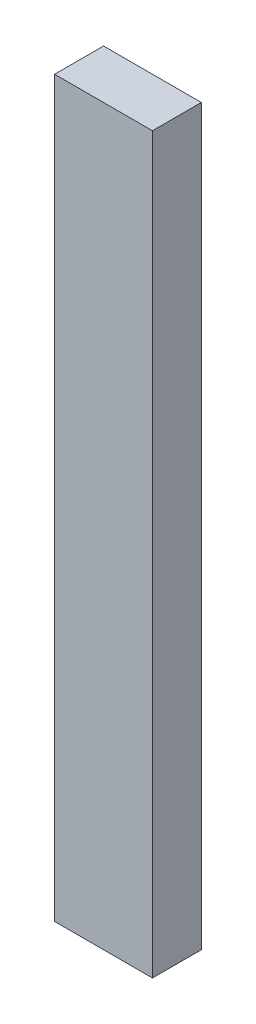
ISO-10303-21;
HEADER;
FILE_DESCRIPTION(('STEP AP214'),'2;1');
FILE_NAME('part.step','',(''),(''),'','','');
FILE_SCHEMA(('AUTOMOTIVE_DESIGN { 1 0 10303 214 1 1 1 1 }'));
ENDSEC;
DATA;
#1=APPLICATION_CONTEXT('core data for automotive mechanical design processes');
#2=APPLICATION_PROTOCOL_DEFINITION('international standard','automotive_design',2000,#1);
#3=PRODUCT_CONTEXT('',#1,'mechanical');
#4=PRODUCT('Part','Part','',(#3));
#5=PRODUCT_RELATED_PRODUCT_CATEGORY('part','',(#4));
#6=PRODUCT_DEFINITION_FORMATION('','',#4);
#7=PRODUCT_DEFINITION_CONTEXT('part definition',#1,'design');
#8=PRODUCT_DEFINITION('design','',#6,#7);
#9=PRODUCT_DEFINITION_SHAPE('','',#8);
#10=(LENGTH_UNIT() NAMED_UNIT(*) SI_UNIT(.MILLI.,.METRE.));
#11=(NAMED_UNIT(*) PLANE_ANGLE_UNIT() SI_UNIT($,.RADIAN.));
#12=(NAMED_UNIT(*) SI_UNIT($,.STERADIAN.) SOLID_ANGLE_UNIT());
#13=UNCERTAINTY_MEASURE_WITH_UNIT(LENGTH_MEASURE(1.E-05),#10,'distance_accuracy_value','');
#14=(GEOMETRIC_REPRESENTATION_CONTEXT(3) GLOBAL_UNCERTAINTY_ASSIGNED_CONTEXT((#13)) GLOBAL_UNIT_ASSIGNED_CONTEXT((#10,
#11,#12)) REPRESENTATION_CONTEXT('',''));
#15=CARTESIAN_POINT('',(0.,0.,0.));
#16=DIRECTION('',(0.,0.,1.));
#17=DIRECTION('',(1.,0.,0.));
#18=AXIS2_PLACEMENT_3D('',#15,#16,#17);
#19=CARTESIAN_POINT('',(10.,150.,-5.));
#20=DIRECTION('',(-1.,0.,0.));
#21=DIRECTION('',(0.,0.,1.));
#22=AXIS2_PLACEMENT_3D('',#19,#20,#21);
#23=PLANE('',#22);
#24=DIRECTION('',(0.,0.,-1.));
#25=VECTOR('',#24,1.);
#26=CARTESIAN_POINT('',(10.,0.,-5.));
#27=LINE('',#26,#25);
#28=CARTESIAN_POINT('',(10.,0.,5.));
#29=VERTEX_POINT('',#28);
#30=CARTESIAN_POINT('',(10.,0.,-5.));
#31=VERTEX_POINT('',#30);
#32=EDGE_CURVE('E95',#29,#31,#27,.T.);
#33=ORIENTED_EDGE('',*,*,#32,.T.);
#34=DIRECTION('',(0.,-1.,0.));
#35=VECTOR('',#34,1.);
#36=CARTESIAN_POINT('',(10.,150.,-5.));
#37=LINE('',#36,#35);
#38=CARTESIAN_POINT('',(10.,150.,-5.));
#39=VERTEX_POINT('',#38);
#40=EDGE_CURVE('E11',#39,#31,#37,.T.);
#41=ORIENTED_EDGE('',*,*,#40,.F.);
#42=DIRECTION('',(0.,0.,-1.));
#43=VECTOR('',#42,1.);
#44=CARTESIAN_POINT('',(10.,150.,-5.));
#45=LINE('',#44,#43);
#46=CARTESIAN_POINT('',(10.,150.,5.));
#47=VERTEX_POINT('',#46);
#48=EDGE_CURVE('E83',#47,#39,#45,.T.);
#49=ORIENTED_EDGE('',*,*,#48,.F.);
#50=DIRECTION('',(0.,-1.,0.));
#51=VECTOR('',#50,1.);
#52=CARTESIAN_POINT('',(10.,150.,5.));
#53=LINE('',#52,#51);
#54=EDGE_CURVE('E91',#47,#29,#53,.T.);
#55=ORIENTED_EDGE('',*,*,#54,.T.);
#56=EDGE_LOOP('',(#33,#41,#49,#55));
#57=FACE_BOUND('',#56,.T.);
#58=ADVANCED_FACE('F32',(#57),#23,.F.);
#59=CARTESIAN_POINT('',(-10.,150.,-5.));
#60=DIRECTION('',(0.,0.,1.));
#61=DIRECTION('',(1.,0.,0.));
#62=AXIS2_PLACEMENT_3D('',#59,#60,#61);
#63=PLANE('',#62);
#64=DIRECTION('',(-1.,0.,0.));
#65=VECTOR('',#64,1.);
#66=CARTESIAN_POINT('',(-10.,0.,-5.));
#67=LINE('',#66,#65);
#68=CARTESIAN_POINT('',(-10.,0.,-5.));
#69=VERTEX_POINT('',#68);
#70=EDGE_CURVE('E87',#31,#69,#67,.T.);
#71=ORIENTED_EDGE('',*,*,#70,.T.);
#72=DIRECTION('',(0.,-1.,0.));
#73=VECTOR('',#72,1.);
#74=CARTESIAN_POINT('',(-10.,150.,-5.));
#75=LINE('',#74,#73);
#76=CARTESIAN_POINT('',(-10.,150.,-5.));
#77=VERTEX_POINT('',#76);
#78=EDGE_CURVE('E40',#77,#69,#75,.T.);
#79=ORIENTED_EDGE('',*,*,#78,.F.);
#80=DIRECTION('',(-1.,0.,0.));
#81=VECTOR('',#80,1.);
#82=CARTESIAN_POINT('',(-10.,150.,-5.));
#83=LINE('',#82,#81);
#84=EDGE_CURVE('E78',#39,#77,#83,.T.);
#85=ORIENTED_EDGE('',*,*,#84,.F.);
#86=ORIENTED_EDGE('',*,*,#40,.T.);
#87=EDGE_LOOP('',(#71,#79,#85,#86));
#88=FACE_BOUND('',#87,.T.);
#89=ADVANCED_FACE('F86',(#88),#63,.F.);
#90=CARTESIAN_POINT('',(-10.,150.,-5.));
#91=DIRECTION('',(1.,0.,0.));
#92=DIRECTION('',(0.,0.,-1.));
#93=AXIS2_PLACEMENT_3D('',#90,#91,#92);
#94=PLANE('',#93);
#95=DIRECTION('',(0.,0.,1.));
#96=VECTOR('',#95,1.);
#97=CARTESIAN_POINT('',(-10.,0.,-5.));
#98=LINE('',#97,#96);
#99=CARTESIAN_POINT('',(-10.,0.,5.));
#100=VERTEX_POINT('',#99);
#101=EDGE_CURVE('E65',#69,#100,#98,.T.);
#102=ORIENTED_EDGE('',*,*,#101,.T.);
#103=DIRECTION('',(0.,-1.,0.));
#104=VECTOR('',#103,1.);
#105=CARTESIAN_POINT('',(-10.,150.,5.));
#106=LINE('',#105,#104);
#107=CARTESIAN_POINT('',(-10.,150.,5.));
#108=VERTEX_POINT('',#107);
#109=EDGE_CURVE('E88',#108,#100,#106,.T.);
#110=ORIENTED_EDGE('',*,*,#109,.F.);
#111=DIRECTION('',(0.,0.,1.));
#112=VECTOR('',#111,1.);
#113=CARTESIAN_POINT('',(-10.,150.,-5.));
#114=LINE('',#113,#112);
#115=EDGE_CURVE('E81',#77,#108,#114,.T.);
#116=ORIENTED_EDGE('',*,*,#115,.F.);
#117=ORIENTED_EDGE('',*,*,#78,.T.);
#118=EDGE_LOOP('',(#102,#110,#116,#117));
#119=FACE_BOUND('',#118,.T.);
#120=ADVANCED_FACE('F89',(#119),#94,.F.);
#121=CARTESIAN_POINT('',(-10.,150.,5.));
#122=DIRECTION('',(0.,0.,-1.));
#123=DIRECTION('',(-1.,0.,0.));
#124=AXIS2_PLACEMENT_3D('',#121,#122,#123);
#125=PLANE('',#124);
#126=DIRECTION('',(1.,0.,0.));
#127=VECTOR('',#126,1.);
#128=CARTESIAN_POINT('',(-10.,0.,5.));
#129=LINE('',#128,#127);
#130=EDGE_CURVE('E71',#100,#29,#129,.T.);
#131=ORIENTED_EDGE('',*,*,#130,.T.);
#132=ORIENTED_EDGE('',*,*,#54,.F.);
#133=DIRECTION('',(1.,0.,0.));
#134=VECTOR('',#133,1.);
#135=CARTESIAN_POINT('',(-10.,150.,5.));
#136=LINE('',#135,#134);
#137=EDGE_CURVE('E48',#108,#47,#136,.T.);
#138=ORIENTED_EDGE('',*,*,#137,.F.);
#139=ORIENTED_EDGE('',*,*,#109,.T.);
#140=EDGE_LOOP('',(#131,#132,#138,#139));
#141=FACE_BOUND('',#140,.T.);
#142=ADVANCED_FACE('F102',(#141),#125,.F.);
#143=CARTESIAN_POINT('',(0.,150.,0.));
#144=DIRECTION('',(0.,1.,0.));
#145=DIRECTION('',(0.,0.,1.));
#146=AXIS2_PLACEMENT_3D('',#143,#144,#145);
#147=PLANE('',#146);
#148=ORIENTED_EDGE('',*,*,#48,.T.);
#149=ORIENTED_EDGE('',*,*,#84,.T.);
#150=ORIENTED_EDGE('',*,*,#115,.T.);
#151=ORIENTED_EDGE('',*,*,#137,.T.);
#152=EDGE_LOOP('',(#148,#149,#150,#151));
#153=FACE_BOUND('',#152,.T.);
#154=ADVANCED_FACE('F79',(#153),#147,.T.);
#155=CARTESIAN_POINT('',(0.,0.,0.));
#156=DIRECTION('',(0.,1.,0.));
#157=DIRECTION('',(0.,0.,1.));
#158=AXIS2_PLACEMENT_3D('',#155,#156,#157);
#159=PLANE('',#158);
#160=ORIENTED_EDGE('',*,*,#32,.F.);
#161=ORIENTED_EDGE('',*,*,#130,.F.);
#162=ORIENTED_EDGE('',*,*,#101,.F.);
#163=ORIENTED_EDGE('',*,*,#70,.F.);
#164=EDGE_LOOP('',(#160,#161,#162,#163));
#165=FACE_BOUND('',#164,.T.);
#166=ADVANCED_FACE('F105',(#165),#159,.F.);
#167=CLOSED_SHELL('',(#58,#89,#120,#142,#154,#166));
#168=MANIFOLD_SOLID_BREP('B2',#167);
#169=ADVANCED_BREP_SHAPE_REPRESENTATION('',(#18,#168),#14);
#170=SHAPE_DEFINITION_REPRESENTATION(#9,#169);
ENDSEC;
END-ISO-10303-21;
